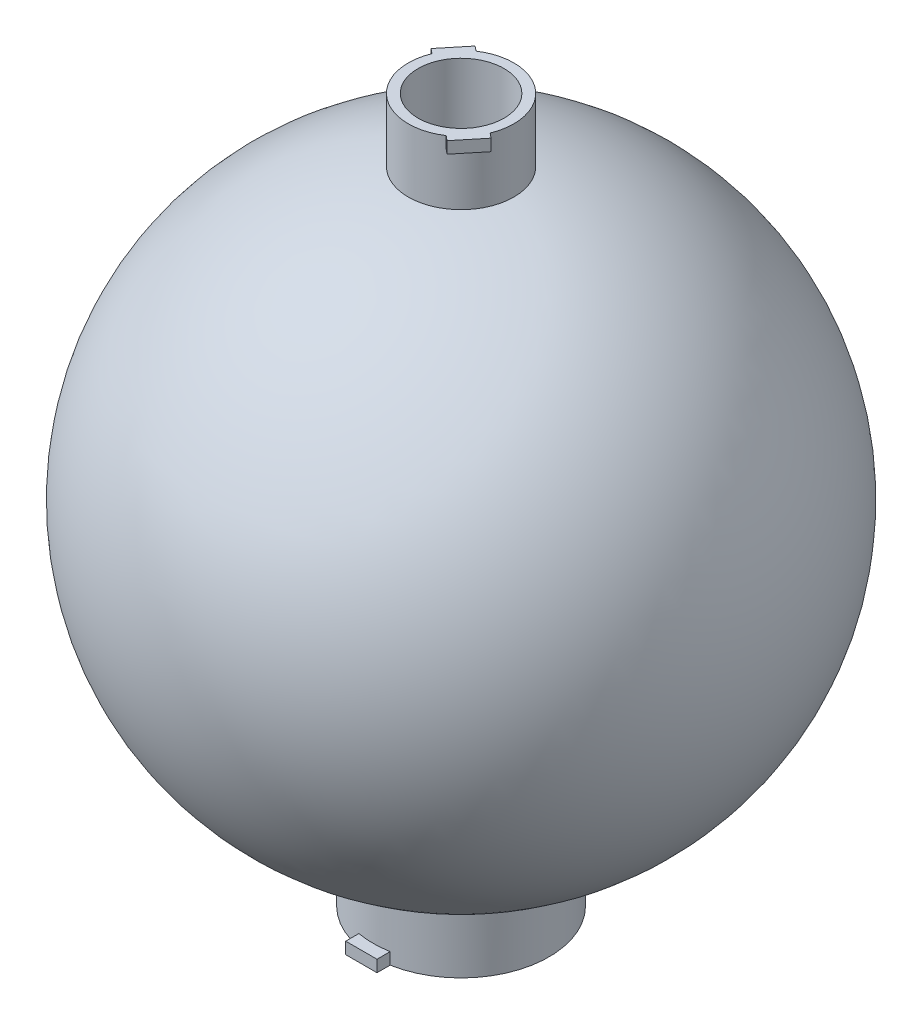
ISO-10303-21;
HEADER;
FILE_DESCRIPTION(('STEP AP214'),'2;1');
FILE_NAME('part.step','',(''),(''),'','','');
FILE_SCHEMA(('AUTOMOTIVE_DESIGN { 1 0 10303 214 1 1 1 1 }'));
ENDSEC;
DATA;
#1=APPLICATION_CONTEXT('core data for automotive mechanical design processes');
#2=APPLICATION_PROTOCOL_DEFINITION('international standard','automotive_design',2000,#1);
#3=PRODUCT_CONTEXT('',#1,'mechanical');
#4=PRODUCT('Part','Part','',(#3));
#5=PRODUCT_RELATED_PRODUCT_CATEGORY('part','',(#4));
#6=PRODUCT_DEFINITION_FORMATION('','',#4);
#7=PRODUCT_DEFINITION_CONTEXT('part definition',#1,'design');
#8=PRODUCT_DEFINITION('design','',#6,#7);
#9=PRODUCT_DEFINITION_SHAPE('','',#8);
#10=(LENGTH_UNIT() NAMED_UNIT(*) SI_UNIT(.MILLI.,.METRE.));
#11=(NAMED_UNIT(*) PLANE_ANGLE_UNIT() SI_UNIT($,.RADIAN.));
#12=(NAMED_UNIT(*) SI_UNIT($,.STERADIAN.) SOLID_ANGLE_UNIT());
#13=UNCERTAINTY_MEASURE_WITH_UNIT(LENGTH_MEASURE(1.E-05),#10,'distance_accuracy_value','');
#14=(GEOMETRIC_REPRESENTATION_CONTEXT(3) GLOBAL_UNCERTAINTY_ASSIGNED_CONTEXT((#13)) GLOBAL_UNIT_ASSIGNED_CONTEXT((#10,
#11,#12)) REPRESENTATION_CONTEXT('',''));
#15=CARTESIAN_POINT('',(0.,0.,0.));
#16=DIRECTION('',(0.,0.,1.));
#17=DIRECTION('',(1.,0.,0.));
#18=AXIS2_PLACEMENT_3D('',#15,#16,#17);
#19=CARTESIAN_POINT('',(0.,171.358606825957,0.));
#20=DIRECTION('',(0.,-1.,0.));
#21=DIRECTION('',(0.,0.,-1.));
#22=AXIS2_PLACEMENT_3D('',#19,#20,#21);
#23=CYLINDRICAL_SURFACE('',#22,12.15);
#24=DIRECTION('',(0.,-1.,0.));
#25=VECTOR('',#24,1.);
#26=CARTESIAN_POINT('',(6.70226386970745,171.358606825957,10.1342073701308));
#27=LINE('',#26,#25);
#28=CARTESIAN_POINT('',(6.70226386970745,171.358606825957,10.1342073701308));
#29=VERTEX_POINT('',#28);
#30=CARTESIAN_POINT('',(6.70226386970745,168.658606825957,10.1342073701308));
#31=VERTEX_POINT('',#30);
#32=EDGE_CURVE('E182',#29,#31,#27,.T.);
#33=ORIENTED_EDGE('',*,*,#32,.F.);
#34=CARTESIAN_POINT('',(0.,171.358606825957,0.));
#35=DIRECTION('',(0.,1.,0.));
#36=DIRECTION('',(0.,0.,1.));
#37=AXIS2_PLACEMENT_3D('',#34,#35,#36);
#38=CIRCLE('',#37,12.15);
#39=CARTESIAN_POINT('',(-11.261247976559,171.358606825957,-4.56144648225171));
#40=VERTEX_POINT('',#39);
#41=EDGE_CURVE('E237',#40,#29,#38,.T.);
#42=ORIENTED_EDGE('',*,*,#41,.F.);
#43=DIRECTION('',(0.,-1.,0.));
#44=VECTOR('',#43,1.);
#45=CARTESIAN_POINT('',(-11.261247976559,171.358606825957,-4.56144648225171));
#46=LINE('',#45,#44);
#47=CARTESIAN_POINT('',(-11.261247976559,168.658606825957,-4.56144648225171));
#48=VERTEX_POINT('',#47);
#49=EDGE_CURVE('E232',#48,#40,#46,.F.);
#50=ORIENTED_EDGE('',*,*,#49,.F.);
#51=CARTESIAN_POINT('',(0.,168.658606825957,0.));
#52=DIRECTION('',(0.,1.,0.));
#53=DIRECTION('',(0.,0.,1.));
#54=AXIS2_PLACEMENT_3D('',#51,#52,#53);
#55=CIRCLE('',#54,12.15);
#56=CARTESIAN_POINT('',(-6.70226386970745,168.658606825957,-10.1342073701308));
#57=VERTEX_POINT('',#56);
#58=EDGE_CURVE('E325',#57,#48,#55,.T.);
#59=ORIENTED_EDGE('',*,*,#58,.F.);
#60=DIRECTION('',(0.,-1.,0.));
#61=VECTOR('',#60,1.);
#62=CARTESIAN_POINT('',(-6.70226386970745,171.358606825957,-10.1342073701308));
#63=LINE('',#62,#61);
#64=CARTESIAN_POINT('',(-6.70226386970746,171.358606825957,-10.1342073701308));
#65=VERTEX_POINT('',#64);
#66=EDGE_CURVE('E218',#57,#65,#63,.F.);
#67=ORIENTED_EDGE('',*,*,#66,.T.);
#68=CARTESIAN_POINT('',(11.261247976559,171.358606825957,4.5614464822517));
#69=VERTEX_POINT('',#68);
#70=EDGE_CURVE('E240',#69,#65,#38,.T.);
#71=ORIENTED_EDGE('',*,*,#70,.F.);
#72=DIRECTION('',(0.,-1.,0.));
#73=VECTOR('',#72,1.);
#74=CARTESIAN_POINT('',(11.261247976559,171.358606825957,4.5614464822517));
#75=LINE('',#74,#73);
#76=CARTESIAN_POINT('',(11.261247976559,168.658606825957,4.5614464822517));
#77=VERTEX_POINT('',#76);
#78=EDGE_CURVE('E228',#69,#77,#75,.T.);
#79=ORIENTED_EDGE('',*,*,#78,.T.);
#80=EDGE_CURVE('E327',#31,#77,#55,.T.);
#81=ORIENTED_EDGE('',*,*,#80,.F.);
#82=EDGE_LOOP('',(#33,#42,#50,#59,#67,#71,#79,#81));
#83=FACE_BOUND('',#82,.T.);
#84=CARTESIAN_POINT('',(0.,156.75610301369,0.));
#85=DIRECTION('',(0.,-1.,0.));
#86=DIRECTION('',(0.,0.,-1.));
#87=AXIS2_PLACEMENT_3D('',#84,#85,#86);
#88=CIRCLE('',#87,12.15);
#89=CARTESIAN_POINT('',(0.,156.75610301369,-12.15));
#90=VERTEX_POINT('',#89);
#91=EDGE_CURVE('E11',#90,#90,#88,.T.);
#92=ORIENTED_EDGE('',*,*,#91,.F.);
#93=EDGE_LOOP('',(#92));
#94=FACE_BOUND('',#93,.T.);
#95=ADVANCED_FACE('F48',(#83,#94),#23,.T.);
#96=CARTESIAN_POINT('',(0.,171.358606825957,0.));
#97=DIRECTION('',(0.,1.,0.));
#98=DIRECTION('',(0.,0.,1.));
#99=AXIS2_PLACEMENT_3D('',#96,#97,#98);
#100=PLANE('',#99);
#101=CARTESIAN_POINT('',(0.,171.358606825957,0.));
#102=DIRECTION('',(0.,1.,0.));
#103=DIRECTION('',(0.,0.,1.));
#104=AXIS2_PLACEMENT_3D('',#101,#102,#103);
#105=CIRCLE('',#104,9.9);
#106=CARTESIAN_POINT('',(0.,171.358606825957,9.9));
#107=VERTEX_POINT('',#106);
#108=EDGE_CURVE('E437',#107,#107,#105,.T.);
#109=ORIENTED_EDGE('',*,*,#108,.F.);
#110=EDGE_LOOP('',(#109));
#111=FACE_BOUND('',#110,.T.);
#112=ORIENTED_EDGE('',*,*,#70,.T.);
#113=DIRECTION('',(-0.773994567760989,0.,-0.633192237062711));
#114=VECTOR('',#113,1.);
#115=CARTESIAN_POINT('',(2.27949205342576,171.358606825957,-2.78638044393957));
#116=LINE('',#115,#114);
#117=CARTESIAN_POINT('',(-7.82113705585515,171.358606825957,-11.0495391376079));
#118=VERTEX_POINT('',#117);
#119=EDGE_CURVE('E207',#65,#118,#116,.T.);
#120=ORIENTED_EDGE('',*,*,#119,.T.);
#121=DIRECTION('',(0.63319223706271,0.,-0.773994567760989));
#122=VECTOR('',#121,1.);
#123=CARTESIAN_POINT('',(-10.1006291092809,171.358606825957,-8.26315869366837));
#124=LINE('',#123,#122);
#125=CARTESIAN_POINT('',(-12.3801211627067,171.358606825957,-5.47677824972881));
#126=VERTEX_POINT('',#125);
#127=EDGE_CURVE('E210',#126,#118,#124,.T.);
#128=ORIENTED_EDGE('',*,*,#127,.F.);
#129=DIRECTION('',(-0.773994567760989,0.,-0.633192237062711));
#130=VECTOR('',#129,1.);
#131=CARTESIAN_POINT('',(-2.27949205342576,171.358606825957,2.78638044393956));
#132=LINE('',#131,#130);
#133=EDGE_CURVE('E66',#40,#126,#132,.T.);
#134=ORIENTED_EDGE('',*,*,#133,.F.);
#135=ORIENTED_EDGE('',*,*,#41,.T.);
#136=CARTESIAN_POINT('',(7.82113705585514,171.358606825957,11.0495391376079));
#137=VERTEX_POINT('',#136);
#138=EDGE_CURVE('E202',#137,#29,#132,.T.);
#139=ORIENTED_EDGE('',*,*,#138,.F.);
#140=DIRECTION('',(0.633192237062711,0.,-0.773994567760989));
#141=VECTOR('',#140,1.);
#142=CARTESIAN_POINT('',(10.1006291092809,171.358606825957,8.26315869366837));
#143=LINE('',#142,#141);
#144=CARTESIAN_POINT('',(12.3801211627067,171.358606825957,5.4767782497288));
#145=VERTEX_POINT('',#144);
#146=EDGE_CURVE('E171',#137,#145,#143,.T.);
#147=ORIENTED_EDGE('',*,*,#146,.T.);
#148=EDGE_CURVE('E73',#145,#69,#116,.T.);
#149=ORIENTED_EDGE('',*,*,#148,.T.);
#150=EDGE_LOOP('',(#112,#120,#128,#134,#135,#139,#147,#149));
#151=FACE_BOUND('',#150,.T.);
#152=ADVANCED_FACE('F390',(#111,#151),#100,.T.);
#153=CARTESIAN_POINT('',(-10.1006291092809,168.658606825957,-8.26315869366837));
#154=DIRECTION('',(0.773994567760989,0.,0.63319223706271));
#155=DIRECTION('',(0.63319223706271,0.,-0.773994567760989));
#156=AXIS2_PLACEMENT_3D('',#153,#154,#155);
#157=PLANE('',#156);
#158=ORIENTED_EDGE('',*,*,#127,.T.);
#159=DIRECTION('',(0.,1.,0.));
#160=VECTOR('',#159,1.);
#161=CARTESIAN_POINT('',(-7.82113705585515,168.658606825957,-11.0495391376079));
#162=LINE('',#161,#160);
#163=CARTESIAN_POINT('',(-7.82113705585515,168.658606825957,-11.0495391376079));
#164=VERTEX_POINT('',#163);
#165=EDGE_CURVE('E219',#164,#118,#162,.T.);
#166=ORIENTED_EDGE('',*,*,#165,.F.);
#167=DIRECTION('',(0.63319223706271,0.,-0.773994567760989));
#168=VECTOR('',#167,1.);
#169=CARTESIAN_POINT('',(-10.1006291092809,168.658606825957,-8.26315869366837));
#170=LINE('',#169,#168);
#171=CARTESIAN_POINT('',(-12.3801211627067,168.658606825957,-5.47677824972881));
#172=VERTEX_POINT('',#171);
#173=EDGE_CURVE('E176',#172,#164,#170,.T.);
#174=ORIENTED_EDGE('',*,*,#173,.F.);
#175=DIRECTION('',(0.,1.,0.));
#176=VECTOR('',#175,1.);
#177=CARTESIAN_POINT('',(-12.3801211627067,168.658606825957,-5.47677824972881));
#178=LINE('',#177,#176);
#179=EDGE_CURVE('E214',#172,#126,#178,.T.);
#180=ORIENTED_EDGE('',*,*,#179,.T.);
#181=EDGE_LOOP('',(#158,#166,#174,#180));
#182=FACE_BOUND('',#181,.T.);
#183=ADVANCED_FACE('F394',(#182),#157,.F.);
#184=CARTESIAN_POINT('',(0.,168.658606825957,0.));
#185=DIRECTION('',(0.,1.,0.));
#186=DIRECTION('',(0.,0.,1.));
#187=AXIS2_PLACEMENT_3D('',#184,#185,#186);
#188=PLANE('',#187);
#189=DIRECTION('',(-0.773994567760989,0.,-0.633192237062711));
#190=VECTOR('',#189,1.);
#191=CARTESIAN_POINT('',(2.27949205342576,168.658606825957,-2.78638044393957));
#192=LINE('',#191,#190);
#193=EDGE_CURVE('E193',#57,#164,#192,.T.);
#194=ORIENTED_EDGE('',*,*,#193,.F.);
#195=ORIENTED_EDGE('',*,*,#58,.T.);
#196=DIRECTION('',(-0.773994567760989,0.,-0.633192237062711));
#197=VECTOR('',#196,1.);
#198=CARTESIAN_POINT('',(-2.27949205342576,168.658606825957,2.78638044393956));
#199=LINE('',#198,#197);
#200=EDGE_CURVE('E186',#48,#172,#199,.T.);
#201=ORIENTED_EDGE('',*,*,#200,.T.);
#202=ORIENTED_EDGE('',*,*,#173,.T.);
#203=EDGE_LOOP('',(#194,#195,#201,#202));
#204=FACE_BOUND('',#203,.T.);
#205=ADVANCED_FACE('F409',(#204),#188,.F.);
#206=CARTESIAN_POINT('',(2.27949205342576,168.658606825957,-2.78638044393957));
#207=DIRECTION('',(0.63319223706271,0.,-0.773994567760989));
#208=DIRECTION('',(-0.773994567760989,0.,-0.633192237062711));
#209=AXIS2_PLACEMENT_3D('',#206,#207,#208);
#210=PLANE('',#209);
#211=ORIENTED_EDGE('',*,*,#66,.F.);
#212=ORIENTED_EDGE('',*,*,#193,.T.);
#213=ORIENTED_EDGE('',*,*,#165,.T.);
#214=ORIENTED_EDGE('',*,*,#119,.F.);
#215=EDGE_LOOP('',(#211,#212,#213,#214));
#216=FACE_BOUND('',#215,.T.);
#217=ADVANCED_FACE('F406',(#216),#210,.T.);
#218=CARTESIAN_POINT('',(-2.27949205342576,168.658606825957,2.78638044393956));
#219=DIRECTION('',(0.63319223706271,0.,-0.773994567760989));
#220=DIRECTION('',(-0.773994567760989,0.,-0.633192237062711));
#221=AXIS2_PLACEMENT_3D('',#218,#219,#220);
#222=PLANE('',#221);
#223=ORIENTED_EDGE('',*,*,#200,.F.);
#224=ORIENTED_EDGE('',*,*,#49,.T.);
#225=ORIENTED_EDGE('',*,*,#133,.T.);
#226=ORIENTED_EDGE('',*,*,#179,.F.);
#227=EDGE_LOOP('',(#223,#224,#225,#226));
#228=FACE_BOUND('',#227,.T.);
#229=ADVANCED_FACE('F400',(#228),#222,.F.);
#230=CARTESIAN_POINT('',(7.82113705585514,168.658606825957,11.0495391376079));
#231=VERTEX_POINT('',#230);
#232=EDGE_CURVE('E179',#231,#31,#199,.T.);
#233=ORIENTED_EDGE('',*,*,#232,.T.);
#234=ORIENTED_EDGE('',*,*,#80,.T.);
#235=CARTESIAN_POINT('',(12.3801211627067,168.658606825957,5.4767782497288));
#236=VERTEX_POINT('',#235);
#237=EDGE_CURVE('E191',#236,#77,#192,.T.);
#238=ORIENTED_EDGE('',*,*,#237,.F.);
#239=DIRECTION('',(0.633192237062711,0.,-0.773994567760989));
#240=VECTOR('',#239,1.);
#241=CARTESIAN_POINT('',(10.1006291092809,168.658606825957,8.26315869366837));
#242=LINE('',#241,#240);
#243=EDGE_CURVE('E170',#231,#236,#242,.T.);
#244=ORIENTED_EDGE('',*,*,#243,.F.);
#245=EDGE_LOOP('',(#233,#234,#238,#244));
#246=FACE_BOUND('',#245,.T.);
#247=ADVANCED_FACE('F189',(#246),#188,.F.);
#248=ORIENTED_EDGE('',*,*,#138,.T.);
#249=ORIENTED_EDGE('',*,*,#32,.T.);
#250=ORIENTED_EDGE('',*,*,#232,.F.);
#251=DIRECTION('',(0.,1.,0.));
#252=VECTOR('',#251,1.);
#253=CARTESIAN_POINT('',(7.82113705585514,168.658606825957,11.0495391376079));
#254=LINE('',#253,#252);
#255=EDGE_CURVE('E166',#231,#137,#254,.T.);
#256=ORIENTED_EDGE('',*,*,#255,.T.);
#257=EDGE_LOOP('',(#248,#249,#250,#256));
#258=FACE_BOUND('',#257,.T.);
#259=ADVANCED_FACE('F180',(#258),#222,.F.);
#260=ORIENTED_EDGE('',*,*,#78,.F.);
#261=ORIENTED_EDGE('',*,*,#148,.F.);
#262=DIRECTION('',(0.,1.,0.));
#263=VECTOR('',#262,1.);
#264=CARTESIAN_POINT('',(12.3801211627067,168.658606825957,5.4767782497288));
#265=LINE('',#264,#263);
#266=EDGE_CURVE('E175',#236,#145,#265,.T.);
#267=ORIENTED_EDGE('',*,*,#266,.F.);
#268=ORIENTED_EDGE('',*,*,#237,.T.);
#269=EDGE_LOOP('',(#260,#261,#267,#268));
#270=FACE_BOUND('',#269,.T.);
#271=ADVANCED_FACE('F335',(#270),#210,.T.);
#272=CARTESIAN_POINT('',(10.1006291092809,168.658606825957,8.26315869366837));
#273=DIRECTION('',(0.773994567760989,0.,0.63319223706271));
#274=DIRECTION('',(0.633192237062711,0.,-0.773994567760989));
#275=AXIS2_PLACEMENT_3D('',#272,#273,#274);
#276=PLANE('',#275);
#277=ORIENTED_EDGE('',*,*,#146,.F.);
#278=ORIENTED_EDGE('',*,*,#255,.F.);
#279=ORIENTED_EDGE('',*,*,#243,.T.);
#280=ORIENTED_EDGE('',*,*,#266,.T.);
#281=EDGE_LOOP('',(#277,#278,#279,#280));
#282=FACE_BOUND('',#281,.T.);
#283=ADVANCED_FACE('F168',(#282),#276,.T.);
#284=CARTESIAN_POINT('',(0.,90.3586068259571,0.));
#285=DIRECTION('',(-1.,0.,0.));
#286=DIRECTION('',(0.,0.,-1.));
#287=AXIS2_PLACEMENT_3D('',#284,#285,#286);
#288=SPHERICAL_SURFACE('',#287,67.5);
#289=CARTESIAN_POINT('',(0.,90.3586068259571,0.));
#290=DIRECTION('',(0.,1.,0.));
#291=DIRECTION('',(0.,0.,1.));
#292=AXIS2_PLACEMENT_3D('',#289,#290,#291);
#293=SPHERICAL_SURFACE('',#292,67.5);
#294=CARTESIAN_POINT('',(0.,25.9677107303133,0.));
#295=DIRECTION('',(0.,1.,0.));
#296=DIRECTION('',(0.,0.,1.));
#297=AXIS2_PLACEMENT_3D('',#294,#295,#296);
#298=CIRCLE('',#297,20.25);
#299=CARTESIAN_POINT('',(0.,25.9677107303133,20.25));
#300=VERTEX_POINT('',#299);
#301=EDGE_CURVE('E58',#300,#300,#298,.T.);
#302=ORIENTED_EDGE('',*,*,#301,.T.);
#303=EDGE_LOOP('',(#302));
#304=FACE_BOUND('',#303,.T.);
#305=ORIENTED_EDGE('',*,*,#91,.T.);
#306=EDGE_LOOP('',(#305));
#307=FACE_BOUND('',#306,.T.);
#308=ADVANCED_FACE('F403',(#304,#307),#293,.T.);
#309=CARTESIAN_POINT('',(0.,12.0586068259572,22.95));
#310=DIRECTION('',(0.,0.,-1.));
#311=DIRECTION('',(-1.,0.,0.));
#312=AXIS2_PLACEMENT_3D('',#309,#310,#311);
#313=PLANE('',#312);
#314=DIRECTION('',(1.,0.,0.));
#315=VECTOR('',#314,1.);
#316=CARTESIAN_POINT('',(0.,9.35860682595716,22.95));
#317=LINE('',#316,#315);
#318=CARTESIAN_POINT('',(-3.6,9.35860682595716,22.95));
#319=VERTEX_POINT('',#318);
#320=CARTESIAN_POINT('',(3.6,9.35860682595716,22.95));
#321=VERTEX_POINT('',#320);
#322=EDGE_CURVE('E261',#319,#321,#317,.T.);
#323=ORIENTED_EDGE('',*,*,#322,.T.);
#324=DIRECTION('',(0.,-1.,0.));
#325=VECTOR('',#324,1.);
#326=CARTESIAN_POINT('',(3.6,12.0586068259572,22.95));
#327=LINE('',#326,#325);
#328=CARTESIAN_POINT('',(3.6,12.0586068259572,22.95));
#329=VERTEX_POINT('',#328);
#330=EDGE_CURVE('E270',#329,#321,#327,.T.);
#331=ORIENTED_EDGE('',*,*,#330,.F.);
#332=DIRECTION('',(1.,0.,0.));
#333=VECTOR('',#332,1.);
#334=CARTESIAN_POINT('',(0.,12.0586068259572,22.95));
#335=LINE('',#334,#333);
#336=CARTESIAN_POINT('',(-3.6,12.0586068259572,22.95));
#337=VERTEX_POINT('',#336);
#338=EDGE_CURVE('E249',#337,#329,#335,.T.);
#339=ORIENTED_EDGE('',*,*,#338,.F.);
#340=DIRECTION('',(0.,-1.,0.));
#341=VECTOR('',#340,1.);
#342=CARTESIAN_POINT('',(-3.6,12.0586068259572,22.95));
#343=LINE('',#342,#341);
#344=EDGE_CURVE('E274',#337,#319,#343,.T.);
#345=ORIENTED_EDGE('',*,*,#344,.T.);
#346=EDGE_LOOP('',(#323,#331,#339,#345));
#347=FACE_BOUND('',#346,.T.);
#348=ADVANCED_FACE('F373',(#347),#313,.F.);
#349=CARTESIAN_POINT('',(0.,12.0586068259572,-22.95));
#350=DIRECTION('',(0.,0.,-1.));
#351=DIRECTION('',(-1.,0.,0.));
#352=AXIS2_PLACEMENT_3D('',#349,#350,#351);
#353=PLANE('',#352);
#354=DIRECTION('',(1.,0.,0.));
#355=VECTOR('',#354,1.);
#356=CARTESIAN_POINT('',(0.,9.35860682595716,-22.95));
#357=LINE('',#356,#355);
#358=CARTESIAN_POINT('',(-3.6,9.35860682595716,-22.95));
#359=VERTEX_POINT('',#358);
#360=CARTESIAN_POINT('',(3.6,9.35860682595716,-22.95));
#361=VERTEX_POINT('',#360);
#362=EDGE_CURVE('E301',#359,#361,#357,.T.);
#363=ORIENTED_EDGE('',*,*,#362,.F.);
#364=DIRECTION('',(0.,-1.,0.));
#365=VECTOR('',#364,1.);
#366=CARTESIAN_POINT('',(-3.6,12.0586068259572,-22.95));
#367=LINE('',#366,#365);
#368=CARTESIAN_POINT('',(-3.6,12.0586068259572,-22.95));
#369=VERTEX_POINT('',#368);
#370=EDGE_CURVE('E311',#369,#359,#367,.T.);
#371=ORIENTED_EDGE('',*,*,#370,.F.);
#372=DIRECTION('',(1.,0.,0.));
#373=VECTOR('',#372,1.);
#374=CARTESIAN_POINT('',(0.,12.0586068259572,-22.95));
#375=LINE('',#374,#373);
#376=CARTESIAN_POINT('',(3.6,12.0586068259572,-22.95));
#377=VERTEX_POINT('',#376);
#378=EDGE_CURVE('E289',#369,#377,#375,.T.);
#379=ORIENTED_EDGE('',*,*,#378,.T.);
#380=DIRECTION('',(0.,-1.,0.));
#381=VECTOR('',#380,1.);
#382=CARTESIAN_POINT('',(3.6,12.0586068259572,-22.95));
#383=LINE('',#382,#381);
#384=EDGE_CURVE('E314',#377,#361,#383,.T.);
#385=ORIENTED_EDGE('',*,*,#384,.T.);
#386=EDGE_LOOP('',(#363,#371,#379,#385));
#387=FACE_BOUND('',#386,.T.);
#388=ADVANCED_FACE('F357',(#387),#353,.T.);
#389=CARTESIAN_POINT('',(-3.6,12.0586068259572,0.));
#390=DIRECTION('',(-1.,0.,0.));
#391=DIRECTION('',(0.,0.,1.));
#392=AXIS2_PLACEMENT_3D('',#389,#390,#391);
#393=PLANE('',#392);
#394=DIRECTION('',(0.,0.,-1.));
#395=VECTOR('',#394,1.);
#396=CARTESIAN_POINT('',(-3.6,9.35860682595716,0.));
#397=LINE('',#396,#395);
#398=CARTESIAN_POINT('',(-3.6,9.35860682595716,-19.9274308429361));
#399=VERTEX_POINT('',#398);
#400=EDGE_CURVE('E286',#399,#359,#397,.T.);
#401=ORIENTED_EDGE('',*,*,#400,.F.);
#402=DIRECTION('',(0.,-1.,0.));
#403=VECTOR('',#402,1.);
#404=CARTESIAN_POINT('',(-3.6,12.0586068259572,-19.9274308429361));
#405=LINE('',#404,#403);
#406=CARTESIAN_POINT('',(-3.6,12.0586068259572,-19.9274308429361));
#407=VERTEX_POINT('',#406);
#408=EDGE_CURVE('E297',#407,#399,#405,.T.);
#409=ORIENTED_EDGE('',*,*,#408,.F.);
#410=DIRECTION('',(0.,0.,-1.));
#411=VECTOR('',#410,1.);
#412=CARTESIAN_POINT('',(-3.6,12.0586068259572,0.));
#413=LINE('',#412,#411);
#414=EDGE_CURVE('E293',#407,#369,#413,.T.);
#415=ORIENTED_EDGE('',*,*,#414,.T.);
#416=ORIENTED_EDGE('',*,*,#370,.T.);
#417=EDGE_LOOP('',(#401,#409,#415,#416));
#418=FACE_BOUND('',#417,.T.);
#419=ADVANCED_FACE('F364',(#418),#393,.T.);
#420=CARTESIAN_POINT('',(0.,12.0586068259572,0.));
#421=DIRECTION('',(0.,1.,0.));
#422=DIRECTION('',(0.,0.,1.));
#423=AXIS2_PLACEMENT_3D('',#420,#421,#422);
#424=PLANE('',#423);
#425=CARTESIAN_POINT('',(0.,12.0586068259572,0.));
#426=DIRECTION('',(0.,1.,0.));
#427=DIRECTION('',(0.,0.,1.));
#428=AXIS2_PLACEMENT_3D('',#425,#426,#427);
#429=CIRCLE('',#428,20.25);
#430=CARTESIAN_POINT('',(3.6,12.0586068259572,-19.9274308429361));
#431=VERTEX_POINT('',#430);
#432=EDGE_CURVE('E282',#431,#407,#429,.T.);
#433=ORIENTED_EDGE('',*,*,#432,.F.);
#434=DIRECTION('',(0.,0.,-1.));
#435=VECTOR('',#434,1.);
#436=CARTESIAN_POINT('',(3.6,12.0586068259572,0.));
#437=LINE('',#436,#435);
#438=EDGE_CURVE('E285',#431,#377,#437,.T.);
#439=ORIENTED_EDGE('',*,*,#438,.T.);
#440=ORIENTED_EDGE('',*,*,#378,.F.);
#441=ORIENTED_EDGE('',*,*,#414,.F.);
#442=EDGE_LOOP('',(#433,#439,#440,#441));
#443=FACE_BOUND('',#442,.T.);
#444=ADVANCED_FACE('F361',(#443),#424,.T.);
#445=CARTESIAN_POINT('',(3.6,12.0586068259572,0.));
#446=DIRECTION('',(-1.,0.,0.));
#447=DIRECTION('',(0.,0.,1.));
#448=AXIS2_PLACEMENT_3D('',#445,#446,#447);
#449=PLANE('',#448);
#450=DIRECTION('',(0.,0.,-1.));
#451=VECTOR('',#450,1.);
#452=CARTESIAN_POINT('',(3.6,9.35860682595716,0.));
#453=LINE('',#452,#451);
#454=CARTESIAN_POINT('',(3.6,9.35860682595716,-19.9274308429361));
#455=VERTEX_POINT('',#454);
#456=EDGE_CURVE('E281',#455,#361,#453,.T.);
#457=ORIENTED_EDGE('',*,*,#456,.T.);
#458=ORIENTED_EDGE('',*,*,#384,.F.);
#459=ORIENTED_EDGE('',*,*,#438,.F.);
#460=DIRECTION('',(0.,-1.,0.));
#461=VECTOR('',#460,1.);
#462=CARTESIAN_POINT('',(3.6,12.0586068259572,-19.9274308429361));
#463=LINE('',#462,#461);
#464=EDGE_CURVE('E317',#431,#455,#463,.T.);
#465=ORIENTED_EDGE('',*,*,#464,.T.);
#466=EDGE_LOOP('',(#457,#458,#459,#465));
#467=FACE_BOUND('',#466,.T.);
#468=ADVANCED_FACE('F350',(#467),#449,.F.);
#469=CARTESIAN_POINT('',(3.6,12.0586068259572,0.));
#470=DIRECTION('',(-1.,0.,0.));
#471=DIRECTION('',(0.,0.,1.));
#472=AXIS2_PLACEMENT_3D('',#469,#470,#471);
#473=PLANE('',#472);
#474=DIRECTION('',(0.,0.,-1.));
#475=VECTOR('',#474,1.);
#476=CARTESIAN_POINT('',(3.6,9.35860682595716,0.));
#477=LINE('',#476,#475);
#478=CARTESIAN_POINT('',(3.6,9.35860682595716,19.9274308429361));
#479=VERTEX_POINT('',#478);
#480=EDGE_CURVE('E245',#321,#479,#477,.T.);
#481=ORIENTED_EDGE('',*,*,#480,.T.);
#482=DIRECTION('',(0.,-1.,0.));
#483=VECTOR('',#482,1.);
#484=CARTESIAN_POINT('',(3.6,12.0586068259572,19.9274308429361));
#485=LINE('',#484,#483);
#486=CARTESIAN_POINT('',(3.6,12.0586068259572,19.9274308429361));
#487=VERTEX_POINT('',#486);
#488=EDGE_CURVE('E256',#487,#479,#485,.T.);
#489=ORIENTED_EDGE('',*,*,#488,.F.);
#490=DIRECTION('',(0.,0.,-1.));
#491=VECTOR('',#490,1.);
#492=CARTESIAN_POINT('',(3.6,12.0586068259572,0.));
#493=LINE('',#492,#491);
#494=EDGE_CURVE('E252',#329,#487,#493,.T.);
#495=ORIENTED_EDGE('',*,*,#494,.F.);
#496=ORIENTED_EDGE('',*,*,#330,.T.);
#497=EDGE_LOOP('',(#481,#489,#495,#496));
#498=FACE_BOUND('',#497,.T.);
#499=ADVANCED_FACE('F377',(#498),#473,.F.);
#500=CARTESIAN_POINT('',(0.,12.0586068259572,0.));
#501=DIRECTION('',(0.,1.,0.));
#502=DIRECTION('',(0.,0.,1.));
#503=AXIS2_PLACEMENT_3D('',#500,#501,#502);
#504=PLANE('',#503);
#505=CARTESIAN_POINT('',(0.,12.0586068259572,0.));
#506=DIRECTION('',(0.,1.,0.));
#507=DIRECTION('',(0.,0.,1.));
#508=AXIS2_PLACEMENT_3D('',#505,#506,#507);
#509=CIRCLE('',#508,20.25);
#510=CARTESIAN_POINT('',(-3.6,12.0586068259572,19.9274308429361));
#511=VERTEX_POINT('',#510);
#512=EDGE_CURVE('E241',#511,#487,#509,.T.);
#513=ORIENTED_EDGE('',*,*,#512,.F.);
#514=DIRECTION('',(0.,0.,-1.));
#515=VECTOR('',#514,1.);
#516=CARTESIAN_POINT('',(-3.6,12.0586068259572,0.));
#517=LINE('',#516,#515);
#518=EDGE_CURVE('E244',#337,#511,#517,.T.);
#519=ORIENTED_EDGE('',*,*,#518,.F.);
#520=ORIENTED_EDGE('',*,*,#338,.T.);
#521=ORIENTED_EDGE('',*,*,#494,.T.);
#522=EDGE_LOOP('',(#513,#519,#520,#521));
#523=FACE_BOUND('',#522,.T.);
#524=ADVANCED_FACE('F379',(#523),#504,.T.);
#525=CARTESIAN_POINT('',(-3.6,12.0586068259572,0.));
#526=DIRECTION('',(-1.,0.,0.));
#527=DIRECTION('',(0.,0.,1.));
#528=AXIS2_PLACEMENT_3D('',#525,#526,#527);
#529=PLANE('',#528);
#530=DIRECTION('',(0.,0.,-1.));
#531=VECTOR('',#530,1.);
#532=CARTESIAN_POINT('',(-3.6,9.35860682595716,0.));
#533=LINE('',#532,#531);
#534=CARTESIAN_POINT('',(-3.6,9.35860682595716,19.9274308429361));
#535=VERTEX_POINT('',#534);
#536=EDGE_CURVE('E257',#319,#535,#533,.T.);
#537=ORIENTED_EDGE('',*,*,#536,.F.);
#538=ORIENTED_EDGE('',*,*,#344,.F.);
#539=ORIENTED_EDGE('',*,*,#518,.T.);
#540=DIRECTION('',(0.,-1.,0.));
#541=VECTOR('',#540,1.);
#542=CARTESIAN_POINT('',(-3.6,12.0586068259572,19.9274308429361));
#543=LINE('',#542,#541);
#544=EDGE_CURVE('E277',#511,#535,#543,.T.);
#545=ORIENTED_EDGE('',*,*,#544,.T.);
#546=EDGE_LOOP('',(#537,#538,#539,#545));
#547=FACE_BOUND('',#546,.T.);
#548=ADVANCED_FACE('F368',(#547),#529,.T.);
#549=CARTESIAN_POINT('',(0.,9.35860682595716,0.));
#550=DIRECTION('',(0.,1.,0.));
#551=DIRECTION('',(0.,0.,1.));
#552=AXIS2_PLACEMENT_3D('',#549,#550,#551);
#553=PLANE('',#552);
#554=CARTESIAN_POINT('',(0.,9.35860682595716,0.));
#555=DIRECTION('',(0.,-1.,0.));
#556=DIRECTION('',(0.,0.,-1.));
#557=AXIS2_PLACEMENT_3D('',#554,#555,#556);
#558=CIRCLE('',#557,15.);
#559=CARTESIAN_POINT('',(0.,9.35860682595716,-15.));
#560=VERTEX_POINT('',#559);
#561=EDGE_CURVE('E432',#560,#560,#558,.T.);
#562=ORIENTED_EDGE('',*,*,#561,.F.);
#563=EDGE_LOOP('',(#562));
#564=FACE_BOUND('',#563,.T.);
#565=CARTESIAN_POINT('',(0.,9.35860682595716,0.));
#566=DIRECTION('',(0.,1.,0.));
#567=DIRECTION('',(0.,0.,1.));
#568=AXIS2_PLACEMENT_3D('',#565,#566,#567);
#569=CIRCLE('',#568,20.25);
#570=EDGE_CURVE('E322',#399,#535,#569,.T.);
#571=ORIENTED_EDGE('',*,*,#570,.F.);
#572=ORIENTED_EDGE('',*,*,#400,.T.);
#573=ORIENTED_EDGE('',*,*,#362,.T.);
#574=ORIENTED_EDGE('',*,*,#456,.F.);
#575=EDGE_CURVE('E321',#479,#455,#569,.T.);
#576=ORIENTED_EDGE('',*,*,#575,.F.);
#577=ORIENTED_EDGE('',*,*,#480,.F.);
#578=ORIENTED_EDGE('',*,*,#322,.F.);
#579=ORIENTED_EDGE('',*,*,#536,.T.);
#580=EDGE_LOOP('',(#571,#572,#573,#574,#576,#577,#578,#579));
#581=FACE_BOUND('',#580,.T.);
#582=ADVANCED_FACE('F353',(#564,#581),#553,.F.);
#583=CARTESIAN_POINT('',(0.,90.3586068259571,0.));
#584=DIRECTION('',(0.,-1.,0.));
#585=DIRECTION('',(0.,0.,-1.));
#586=AXIS2_PLACEMENT_3D('',#583,#584,#585);
#587=CYLINDRICAL_SURFACE('',#586,20.25);
#588=ORIENTED_EDGE('',*,*,#570,.T.);
#589=ORIENTED_EDGE('',*,*,#544,.F.);
#590=ORIENTED_EDGE('',*,*,#512,.T.);
#591=ORIENTED_EDGE('',*,*,#488,.T.);
#592=ORIENTED_EDGE('',*,*,#575,.T.);
#593=ORIENTED_EDGE('',*,*,#464,.F.);
#594=ORIENTED_EDGE('',*,*,#432,.T.);
#595=ORIENTED_EDGE('',*,*,#408,.T.);
#596=EDGE_LOOP('',(#588,#589,#590,#591,#592,#593,#594,#595));
#597=FACE_BOUND('',#596,.T.);
#598=ORIENTED_EDGE('',*,*,#301,.F.);
#599=EDGE_LOOP('',(#598));
#600=FACE_BOUND('',#599,.T.);
#601=ADVANCED_FACE('F342',(#597,#600),#587,.T.);
#602=CARTESIAN_POINT('',(0.,-8.64139317404286,0.));
#603=DIRECTION('',(0.,1.,0.));
#604=DIRECTION('',(0.,0.,1.));
#605=AXIS2_PLACEMENT_3D('',#602,#603,#604);
#606=CYLINDRICAL_SURFACE('',#605,9.9);
#607=CARTESIAN_POINT('',(0.,150.752563477265,0.));
#608=DIRECTION('',(0.,-1.,0.));
#609=DIRECTION('',(0.,0.,-1.));
#610=AXIS2_PLACEMENT_3D('',#607,#608,#609);
#611=CIRCLE('',#610,9.9);
#612=CARTESIAN_POINT('',(0.,150.752563477265,-9.9));
#613=VERTEX_POINT('',#612);
#614=EDGE_CURVE('E442',#613,#613,#611,.T.);
#615=ORIENTED_EDGE('',*,*,#614,.T.);
#616=EDGE_LOOP('',(#615));
#617=FACE_BOUND('',#616,.T.);
#618=ORIENTED_EDGE('',*,*,#108,.T.);
#619=EDGE_LOOP('',(#618));
#620=FACE_BOUND('',#619,.T.);
#621=ADVANCED_FACE('F416',(#617,#620),#606,.F.);
#622=CARTESIAN_POINT('',(0.,90.3586068259571,0.));
#623=DIRECTION('',(-1.,0.,0.));
#624=DIRECTION('',(0.,0.,-1.));
#625=AXIS2_PLACEMENT_3D('',#622,#623,#624);
#626=SPHERICAL_SURFACE('',#625,61.2);
#627=CARTESIAN_POINT('',(0.,90.3586068259571,0.));
#628=DIRECTION('',(0.,1.,0.));
#629=DIRECTION('',(0.,0.,1.));
#630=AXIS2_PLACEMENT_3D('',#627,#628,#629);
#631=SPHERICAL_SURFACE('',#630,61.2);
#632=CARTESIAN_POINT('',(0.,31.0253109458192,0.));
#633=DIRECTION('',(0.,1.,0.));
#634=DIRECTION('',(0.,0.,1.));
#635=AXIS2_PLACEMENT_3D('',#632,#633,#634);
#636=CIRCLE('',#635,15.);
#637=CARTESIAN_POINT('',(0.,31.0253109458192,15.));
#638=VERTEX_POINT('',#637);
#639=EDGE_CURVE('E52',#638,#638,#636,.T.);
#640=ORIENTED_EDGE('',*,*,#639,.F.);
#641=EDGE_LOOP('',(#640));
#642=FACE_BOUND('',#641,.T.);
#643=ORIENTED_EDGE('',*,*,#614,.F.);
#644=EDGE_LOOP('',(#643));
#645=FACE_BOUND('',#644,.T.);
#646=ADVANCED_FACE('F50',(#642,#645),#631,.F.);
#647=CARTESIAN_POINT('',(0.,48.3586068259572,0.));
#648=DIRECTION('',(0.,-1.,0.));
#649=DIRECTION('',(0.,0.,-1.));
#650=AXIS2_PLACEMENT_3D('',#647,#648,#649);
#651=CYLINDRICAL_SURFACE('',#650,15.);
#652=ORIENTED_EDGE('',*,*,#639,.T.);
#653=EDGE_LOOP('',(#652));
#654=FACE_BOUND('',#653,.T.);
#655=ORIENTED_EDGE('',*,*,#561,.T.);
#656=EDGE_LOOP('',(#655));
#657=FACE_BOUND('',#656,.T.);
#658=ADVANCED_FACE('F420',(#654,#657),#651,.F.);
#659=CLOSED_SHELL('',(#95,#152,#183,#205,#217,#229,#247,#259,#271,#283,#308,#348,#388,#419,#444,
#468,#499,#524,#548,#582,#601,#621,#646,#658));
#660=MANIFOLD_SOLID_BREP('B2',#659);
#661=ADVANCED_BREP_SHAPE_REPRESENTATION('',(#18,#660),#14);
#662=SHAPE_DEFINITION_REPRESENTATION(#9,#661);
ENDSEC;
END-ISO-10303-21;
